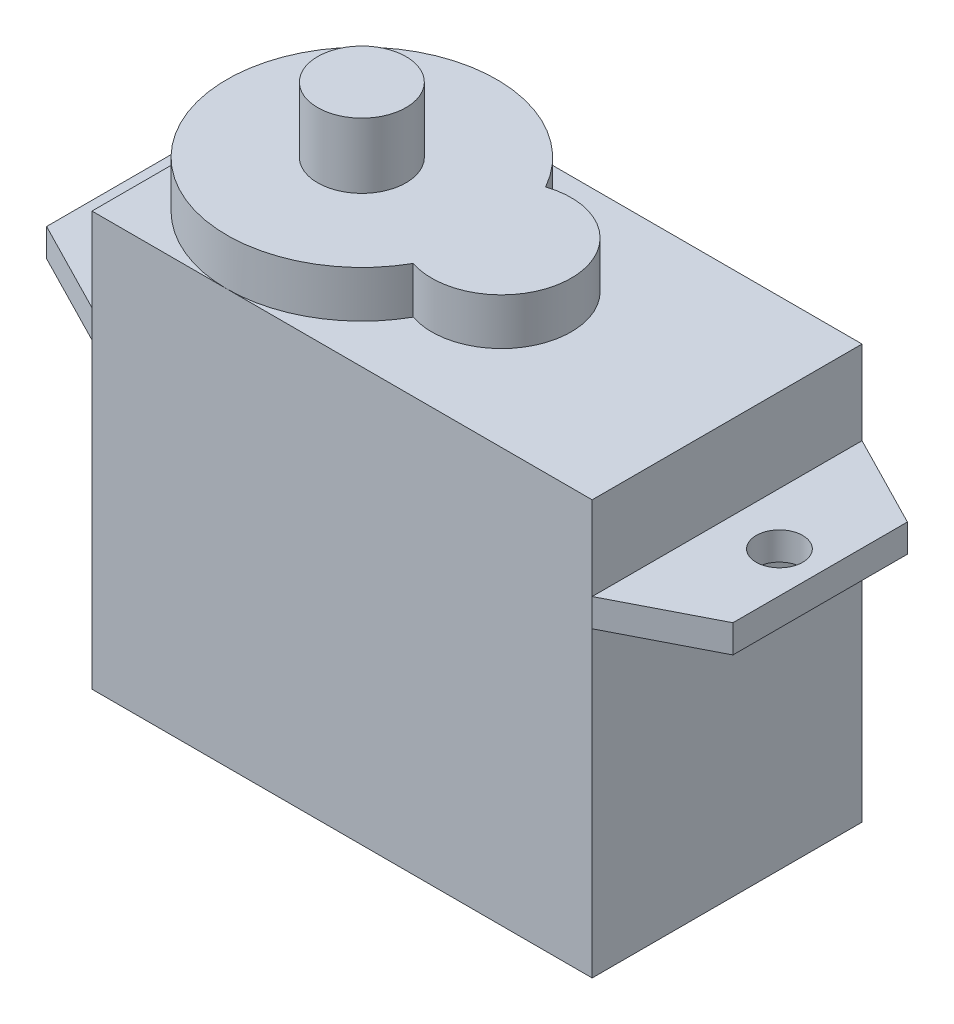
ISO-10303-21;
HEADER;
FILE_DESCRIPTION(('STEP AP214'),'2;1');
FILE_NAME('part.step','',(''),(''),'','','');
FILE_SCHEMA(('AUTOMOTIVE_DESIGN { 1 0 10303 214 1 1 1 1 }'));
ENDSEC;
DATA;
#1=APPLICATION_CONTEXT('core data for automotive mechanical design processes');
#2=APPLICATION_PROTOCOL_DEFINITION('international standard','automotive_design',2000,#1);
#3=PRODUCT_CONTEXT('',#1,'mechanical');
#4=PRODUCT('Part','Part','',(#3));
#5=PRODUCT_RELATED_PRODUCT_CATEGORY('part','',(#4));
#6=PRODUCT_DEFINITION_FORMATION('','',#4);
#7=PRODUCT_DEFINITION_CONTEXT('part definition',#1,'design');
#8=PRODUCT_DEFINITION('design','',#6,#7);
#9=PRODUCT_DEFINITION_SHAPE('','',#8);
#10=(LENGTH_UNIT() NAMED_UNIT(*) SI_UNIT(.MILLI.,.METRE.));
#11=(NAMED_UNIT(*) PLANE_ANGLE_UNIT() SI_UNIT($,.RADIAN.));
#12=(NAMED_UNIT(*) SI_UNIT($,.STERADIAN.) SOLID_ANGLE_UNIT());
#13=UNCERTAINTY_MEASURE_WITH_UNIT(LENGTH_MEASURE(1.E-05),#10,'distance_accuracy_value','');
#14=(GEOMETRIC_REPRESENTATION_CONTEXT(3) GLOBAL_UNCERTAINTY_ASSIGNED_CONTEXT((#13)) GLOBAL_UNIT_ASSIGNED_CONTEXT((#10,
#11,#12)) REPRESENTATION_CONTEXT('',''));
#15=CARTESIAN_POINT('',(0.,0.,0.));
#16=DIRECTION('',(0.,0.,1.));
#17=DIRECTION('',(1.,0.,0.));
#18=AXIS2_PLACEMENT_3D('',#15,#16,#17);
#19=CARTESIAN_POINT('',(0.,17.8,0.));
#20=DIRECTION('',(0.,1.,0.));
#21=DIRECTION('',(0.,0.,1.));
#22=AXIS2_PLACEMENT_3D('',#19,#20,#21);
#23=PLANE('',#22);
#24=CARTESIAN_POINT('',(1.05,17.8,0.));
#25=DIRECTION('',(0.,1.,0.));
#26=DIRECTION('',(0.,0.,1.));
#27=AXIS2_PLACEMENT_3D('',#24,#25,#26);
#28=CIRCLE('',#27,3.);
#29=CARTESIAN_POINT('',(0.103333333333326,17.8,2.84672131095094));
#30=VERTEX_POINT('',#29);
#31=CARTESIAN_POINT('',(0.103333333333326,17.8,-2.84672131095094));
#32=VERTEX_POINT('',#31);
#33=EDGE_CURVE('E161',#30,#32,#28,.T.);
#34=ORIENTED_EDGE('',*,*,#33,.F.);
#35=CARTESIAN_POINT('',(-4.95,17.8,0.));
#36=DIRECTION('',(0.,1.,0.));
#37=DIRECTION('',(0.,0.,1.));
#38=AXIS2_PLACEMENT_3D('',#35,#36,#37);
#39=CIRCLE('',#38,5.8);
#40=CARTESIAN_POINT('',(-4.95,17.8,5.8));
#41=VERTEX_POINT('',#40);
#42=EDGE_CURVE('E286',#41,#30,#39,.T.);
#43=ORIENTED_EDGE('',*,*,#42,.F.);
#44=DIRECTION('',(1.,0.,0.));
#45=VECTOR('',#44,1.);
#46=CARTESIAN_POINT('',(-10.75,17.8,5.8));
#47=LINE('',#46,#45);
#48=CARTESIAN_POINT('',(10.75,17.8,5.8));
#49=VERTEX_POINT('',#48);
#50=EDGE_CURVE('E171',#41,#49,#47,.T.);
#51=ORIENTED_EDGE('',*,*,#50,.T.);
#52=DIRECTION('',(0.,0.,-1.));
#53=VECTOR('',#52,1.);
#54=CARTESIAN_POINT('',(10.75,17.8,-5.8));
#55=LINE('',#54,#53);
#56=CARTESIAN_POINT('',(10.75,17.8,-5.8));
#57=VERTEX_POINT('',#56);
#58=EDGE_CURVE('E176',#49,#57,#55,.T.);
#59=ORIENTED_EDGE('',*,*,#58,.T.);
#60=DIRECTION('',(-1.,0.,0.));
#61=VECTOR('',#60,1.);
#62=CARTESIAN_POINT('',(-10.75,17.8,-5.8));
#63=LINE('',#62,#61);
#64=CARTESIAN_POINT('',(-4.95,17.8,-5.8));
#65=VERTEX_POINT('',#64);
#66=EDGE_CURVE('E179',#57,#65,#63,.T.);
#67=ORIENTED_EDGE('',*,*,#66,.T.);
#68=EDGE_CURVE('E44',#32,#65,#39,.T.);
#69=ORIENTED_EDGE('',*,*,#68,.F.);
#70=EDGE_LOOP('',(#34,#43,#51,#59,#67,#69));
#71=FACE_BOUND('',#70,.T.);
#72=ADVANCED_FACE('F33',(#71),#23,.T.);
#73=CARTESIAN_POINT('',(-10.75,17.8,0.));
#74=VERTEX_POINT('',#73);
#75=EDGE_CURVE('E11',#65,#74,#39,.T.);
#76=ORIENTED_EDGE('',*,*,#75,.F.);
#77=CARTESIAN_POINT('',(-10.75,17.8,-5.8));
#78=VERTEX_POINT('',#77);
#79=EDGE_CURVE('E178',#65,#78,#63,.T.);
#80=ORIENTED_EDGE('',*,*,#79,.T.);
#81=DIRECTION('',(0.,0.,1.));
#82=VECTOR('',#81,1.);
#83=CARTESIAN_POINT('',(-10.75,17.8,-5.8));
#84=LINE('',#83,#82);
#85=EDGE_CURVE('E169',#78,#74,#84,.T.);
#86=ORIENTED_EDGE('',*,*,#85,.T.);
#87=EDGE_LOOP('',(#76,#80,#86));
#88=FACE_BOUND('',#87,.T.);
#89=ADVANCED_FACE('F311',(#88),#23,.T.);
#90=CARTESIAN_POINT('',(0.,14.2,0.));
#91=DIRECTION('',(0.,1.,0.));
#92=DIRECTION('',(0.,0.,1.));
#93=AXIS2_PLACEMENT_3D('',#90,#91,#92);
#94=PLANE('',#93);
#95=DIRECTION('',(0.,0.,1.));
#96=VECTOR('',#95,1.);
#97=CARTESIAN_POINT('',(-10.75,14.2,-5.8));
#98=LINE('',#97,#96);
#99=CARTESIAN_POINT('',(-10.75,14.2,-5.8));
#100=VERTEX_POINT('',#99);
#101=CARTESIAN_POINT('',(-10.75,14.2,5.8));
#102=VERTEX_POINT('',#101);
#103=EDGE_CURVE('E162',#100,#102,#98,.T.);
#104=ORIENTED_EDGE('',*,*,#103,.F.);
#105=DIRECTION('',(-0.889933250556876,0.,0.456090790910399));
#106=VECTOR('',#105,1.);
#107=CARTESIAN_POINT('',(-10.75,14.2,-5.8));
#108=LINE('',#107,#106);
#109=CARTESIAN_POINT('',(-14.75,14.2,-3.75));
#110=VERTEX_POINT('',#109);
#111=EDGE_CURVE('E217',#100,#110,#108,.T.);
#112=ORIENTED_EDGE('',*,*,#111,.T.);
#113=DIRECTION('',(0.,0.,1.));
#114=VECTOR('',#113,1.);
#115=CARTESIAN_POINT('',(-14.75,14.2,-3.75));
#116=LINE('',#115,#114);
#117=CARTESIAN_POINT('',(-14.75,14.2,3.75));
#118=VERTEX_POINT('',#117);
#119=EDGE_CURVE('E219',#110,#118,#116,.T.);
#120=ORIENTED_EDGE('',*,*,#119,.T.);
#121=DIRECTION('',(0.889933250556876,0.,0.456090790910399));
#122=VECTOR('',#121,1.);
#123=CARTESIAN_POINT('',(-14.75,14.2,3.75));
#124=LINE('',#123,#122);
#125=EDGE_CURVE('E221',#118,#102,#124,.T.);
#126=ORIENTED_EDGE('',*,*,#125,.T.);
#127=EDGE_LOOP('',(#104,#112,#120,#126));
#128=FACE_BOUND('',#127,.T.);
#129=CARTESIAN_POINT('',(-13.,14.2,0.));
#130=DIRECTION('',(0.,1.,0.));
#131=DIRECTION('',(0.,0.,1.));
#132=AXIS2_PLACEMENT_3D('',#129,#130,#131);
#133=CIRCLE('',#132,1.);
#134=CARTESIAN_POINT('',(-13.,14.2,1.));
#135=VERTEX_POINT('',#134);
#136=EDGE_CURVE('E202',#135,#135,#133,.T.);
#137=ORIENTED_EDGE('',*,*,#136,.F.);
#138=EDGE_LOOP('',(#137));
#139=FACE_BOUND('',#138,.T.);
#140=ADVANCED_FACE('F317',(#128,#139),#94,.T.);
#141=CARTESIAN_POINT('',(10.75,13.,-5.8));
#142=DIRECTION('',(-1.,0.,0.));
#143=DIRECTION('',(0.,0.,1.));
#144=AXIS2_PLACEMENT_3D('',#141,#142,#143);
#145=PLANE('',#144);
#146=DIRECTION('',(0.,0.,-1.));
#147=VECTOR('',#146,1.);
#148=CARTESIAN_POINT('',(10.75,0.,-5.8));
#149=LINE('',#148,#147);
#150=CARTESIAN_POINT('',(10.75,0.,5.8));
#151=VERTEX_POINT('',#150);
#152=CARTESIAN_POINT('',(10.75,0.,-5.8));
#153=VERTEX_POINT('',#152);
#154=EDGE_CURVE('E260',#151,#153,#149,.T.);
#155=ORIENTED_EDGE('',*,*,#154,.T.);
#156=DIRECTION('',(0.,-1.,0.));
#157=VECTOR('',#156,1.);
#158=CARTESIAN_POINT('',(10.75,13.,-5.8));
#159=LINE('',#158,#157);
#160=CARTESIAN_POINT('',(10.75,13.,-5.8));
#161=VERTEX_POINT('',#160);
#162=EDGE_CURVE('E37',#161,#153,#159,.T.);
#163=ORIENTED_EDGE('',*,*,#162,.F.);
#164=DIRECTION('',(0.,0.,-1.));
#165=VECTOR('',#164,1.);
#166=CARTESIAN_POINT('',(10.75,13.,-5.8));
#167=LINE('',#166,#165);
#168=CARTESIAN_POINT('',(10.75,13.,5.8));
#169=VERTEX_POINT('',#168);
#170=EDGE_CURVE('E261',#169,#161,#167,.T.);
#171=ORIENTED_EDGE('',*,*,#170,.F.);
#172=DIRECTION('',(0.,-1.,0.));
#173=VECTOR('',#172,1.);
#174=CARTESIAN_POINT('',(10.75,13.,5.8));
#175=LINE('',#174,#173);
#176=EDGE_CURVE('E268',#169,#151,#175,.T.);
#177=ORIENTED_EDGE('',*,*,#176,.T.);
#178=EDGE_LOOP('',(#155,#163,#171,#177));
#179=FACE_BOUND('',#178,.T.);
#180=ADVANCED_FACE('F35',(#179),#145,.F.);
#181=CARTESIAN_POINT('',(-10.75,13.,-5.8));
#182=DIRECTION('',(0.,0.,1.));
#183=DIRECTION('',(1.,0.,0.));
#184=AXIS2_PLACEMENT_3D('',#181,#182,#183);
#185=PLANE('',#184);
#186=DIRECTION('',(-1.,0.,0.));
#187=VECTOR('',#186,1.);
#188=CARTESIAN_POINT('',(-10.75,0.,-5.8));
#189=LINE('',#188,#187);
#190=CARTESIAN_POINT('',(-10.75,0.,-5.8));
#191=VERTEX_POINT('',#190);
#192=EDGE_CURVE('E271',#153,#191,#189,.T.);
#193=ORIENTED_EDGE('',*,*,#192,.T.);
#194=DIRECTION('',(0.,-1.,0.));
#195=VECTOR('',#194,1.);
#196=CARTESIAN_POINT('',(-10.75,13.,-5.8));
#197=LINE('',#196,#195);
#198=CARTESIAN_POINT('',(-10.75,13.,-5.8));
#199=VERTEX_POINT('',#198);
#200=EDGE_CURVE('E280',#199,#191,#197,.T.);
#201=ORIENTED_EDGE('',*,*,#200,.F.);
#202=DIRECTION('',(0.,-1.,0.));
#203=VECTOR('',#202,1.);
#204=CARTESIAN_POINT('',(-10.75,14.2,-5.8));
#205=LINE('',#204,#203);
#206=EDGE_CURVE('E248',#100,#199,#205,.T.);
#207=ORIENTED_EDGE('',*,*,#206,.F.);
#208=DIRECTION('',(0.,-1.,0.));
#209=VECTOR('',#208,1.);
#210=CARTESIAN_POINT('',(-10.75,17.8,-5.8));
#211=LINE('',#210,#209);
#212=EDGE_CURVE('E180',#78,#100,#211,.T.);
#213=ORIENTED_EDGE('',*,*,#212,.F.);
#214=ORIENTED_EDGE('',*,*,#79,.F.);
#215=ORIENTED_EDGE('',*,*,#66,.F.);
#216=DIRECTION('',(0.,-1.,0.));
#217=VECTOR('',#216,1.);
#218=CARTESIAN_POINT('',(10.75,17.8,-5.8));
#219=LINE('',#218,#217);
#220=CARTESIAN_POINT('',(10.75,14.2,-5.8));
#221=VERTEX_POINT('',#220);
#222=EDGE_CURVE('E186',#57,#221,#219,.T.);
#223=ORIENTED_EDGE('',*,*,#222,.T.);
#224=DIRECTION('',(0.,-1.,0.));
#225=VECTOR('',#224,1.);
#226=CARTESIAN_POINT('',(10.75,14.2,-5.8));
#227=LINE('',#226,#225);
#228=EDGE_CURVE('E251',#221,#161,#227,.T.);
#229=ORIENTED_EDGE('',*,*,#228,.T.);
#230=ORIENTED_EDGE('',*,*,#162,.T.);
#231=EDGE_LOOP('',(#193,#201,#207,#213,#214,#215,#223,#229,#230));
#232=FACE_BOUND('',#231,.T.);
#233=ADVANCED_FACE('F337',(#232),#185,.F.);
#234=CARTESIAN_POINT('',(-10.75,13.,-5.8));
#235=DIRECTION('',(1.,0.,0.));
#236=DIRECTION('',(0.,0.,-1.));
#237=AXIS2_PLACEMENT_3D('',#234,#235,#236);
#238=PLANE('',#237);
#239=DIRECTION('',(0.,0.,1.));
#240=VECTOR('',#239,1.);
#241=CARTESIAN_POINT('',(-10.75,0.,-5.8));
#242=LINE('',#241,#240);
#243=CARTESIAN_POINT('',(-10.75,0.,5.8));
#244=VERTEX_POINT('',#243);
#245=EDGE_CURVE('E273',#191,#244,#242,.T.);
#246=ORIENTED_EDGE('',*,*,#245,.T.);
#247=DIRECTION('',(0.,-1.,0.));
#248=VECTOR('',#247,1.);
#249=CARTESIAN_POINT('',(-10.75,13.,5.8));
#250=LINE('',#249,#248);
#251=CARTESIAN_POINT('',(-10.75,13.,5.8));
#252=VERTEX_POINT('',#251);
#253=EDGE_CURVE('E278',#252,#244,#250,.T.);
#254=ORIENTED_EDGE('',*,*,#253,.F.);
#255=DIRECTION('',(0.,0.,1.));
#256=VECTOR('',#255,1.);
#257=CARTESIAN_POINT('',(-10.75,13.,-5.8));
#258=LINE('',#257,#256);
#259=EDGE_CURVE('E264',#199,#252,#258,.T.);
#260=ORIENTED_EDGE('',*,*,#259,.F.);
#261=ORIENTED_EDGE('',*,*,#200,.T.);
#262=EDGE_LOOP('',(#246,#254,#260,#261));
#263=FACE_BOUND('',#262,.T.);
#264=ADVANCED_FACE('F379',(#263),#238,.F.);
#265=CARTESIAN_POINT('',(-10.75,13.,5.8));
#266=DIRECTION('',(0.,0.,-1.));
#267=DIRECTION('',(-1.,0.,0.));
#268=AXIS2_PLACEMENT_3D('',#265,#266,#267);
#269=PLANE('',#268);
#270=DIRECTION('',(1.,0.,0.));
#271=VECTOR('',#270,1.);
#272=CARTESIAN_POINT('',(-10.75,0.,5.8));
#273=LINE('',#272,#271);
#274=EDGE_CURVE('E265',#244,#151,#273,.T.);
#275=ORIENTED_EDGE('',*,*,#274,.T.);
#276=ORIENTED_EDGE('',*,*,#176,.F.);
#277=DIRECTION('',(0.,-1.,0.));
#278=VECTOR('',#277,1.);
#279=CARTESIAN_POINT('',(10.75,14.2,5.8));
#280=LINE('',#279,#278);
#281=CARTESIAN_POINT('',(10.75,14.2,5.8));
#282=VERTEX_POINT('',#281);
#283=EDGE_CURVE('E223',#282,#169,#280,.T.);
#284=ORIENTED_EDGE('',*,*,#283,.F.);
#285=DIRECTION('',(0.,-1.,0.));
#286=VECTOR('',#285,1.);
#287=CARTESIAN_POINT('',(10.75,17.8,5.8));
#288=LINE('',#287,#286);
#289=EDGE_CURVE('E189',#49,#282,#288,.T.);
#290=ORIENTED_EDGE('',*,*,#289,.F.);
#291=ORIENTED_EDGE('',*,*,#50,.F.);
#292=CARTESIAN_POINT('',(-10.75,17.8,5.8));
#293=VERTEX_POINT('',#292);
#294=EDGE_CURVE('E173',#293,#41,#47,.T.);
#295=ORIENTED_EDGE('',*,*,#294,.F.);
#296=DIRECTION('',(0.,-1.,0.));
#297=VECTOR('',#296,1.);
#298=CARTESIAN_POINT('',(-10.75,17.8,5.8));
#299=LINE('',#298,#297);
#300=EDGE_CURVE('E192',#293,#102,#299,.T.);
#301=ORIENTED_EDGE('',*,*,#300,.T.);
#302=DIRECTION('',(0.,-1.,0.));
#303=VECTOR('',#302,1.);
#304=CARTESIAN_POINT('',(-10.75,14.2,5.8));
#305=LINE('',#304,#303);
#306=EDGE_CURVE('E239',#102,#252,#305,.T.);
#307=ORIENTED_EDGE('',*,*,#306,.T.);
#308=ORIENTED_EDGE('',*,*,#253,.T.);
#309=EDGE_LOOP('',(#275,#276,#284,#290,#291,#295,#301,#307,#308));
#310=FACE_BOUND('',#309,.T.);
#311=ADVANCED_FACE('F350',(#310),#269,.F.);
#312=CARTESIAN_POINT('',(0.,0.,0.));
#313=DIRECTION('',(0.,1.,0.));
#314=DIRECTION('',(0.,0.,1.));
#315=AXIS2_PLACEMENT_3D('',#312,#313,#314);
#316=PLANE('',#315);
#317=ORIENTED_EDGE('',*,*,#154,.F.);
#318=ORIENTED_EDGE('',*,*,#274,.F.);
#319=ORIENTED_EDGE('',*,*,#245,.F.);
#320=ORIENTED_EDGE('',*,*,#192,.F.);
#321=EDGE_LOOP('',(#317,#318,#319,#320));
#322=FACE_BOUND('',#321,.T.);
#323=ADVANCED_FACE('F378',(#322),#316,.F.);
#324=CARTESIAN_POINT('',(0.,13.,0.));
#325=DIRECTION('',(0.,1.,0.));
#326=DIRECTION('',(0.,0.,1.));
#327=AXIS2_PLACEMENT_3D('',#324,#325,#326);
#328=PLANE('',#327);
#329=CARTESIAN_POINT('',(13.,13.,0.));
#330=DIRECTION('',(0.,1.,0.));
#331=DIRECTION('',(0.,0.,-1.));
#332=AXIS2_PLACEMENT_3D('',#329,#330,#331);
#333=CIRCLE('',#332,1.);
#334=CARTESIAN_POINT('',(13.,13.,-1.));
#335=VERTEX_POINT('',#334);
#336=EDGE_CURVE('E195',#335,#335,#333,.T.);
#337=ORIENTED_EDGE('',*,*,#336,.T.);
#338=EDGE_LOOP('',(#337));
#339=FACE_BOUND('',#338,.T.);
#340=DIRECTION('',(0.889933250556876,0.,-0.456090790910399));
#341=VECTOR('',#340,1.);
#342=CARTESIAN_POINT('',(14.75,13.,3.75));
#343=LINE('',#342,#341);
#344=CARTESIAN_POINT('',(14.75,13.,3.75));
#345=VERTEX_POINT('',#344);
#346=EDGE_CURVE('E205',#169,#345,#343,.T.);
#347=ORIENTED_EDGE('',*,*,#346,.F.);
#348=ORIENTED_EDGE('',*,*,#170,.T.);
#349=DIRECTION('',(-0.889933250556876,0.,-0.456090790910399));
#350=VECTOR('',#349,1.);
#351=CARTESIAN_POINT('',(10.75,13.,-5.8));
#352=LINE('',#351,#350);
#353=CARTESIAN_POINT('',(14.75,13.,-3.75));
#354=VERTEX_POINT('',#353);
#355=EDGE_CURVE('E228',#354,#161,#352,.T.);
#356=ORIENTED_EDGE('',*,*,#355,.F.);
#357=DIRECTION('',(0.,0.,-1.));
#358=VECTOR('',#357,1.);
#359=CARTESIAN_POINT('',(14.75,13.,-3.75));
#360=LINE('',#359,#358);
#361=EDGE_CURVE('E226',#345,#354,#360,.T.);
#362=ORIENTED_EDGE('',*,*,#361,.F.);
#363=EDGE_LOOP('',(#347,#348,#356,#362));
#364=FACE_BOUND('',#363,.T.);
#365=ADVANCED_FACE('F370',(#339,#364),#328,.F.);
#366=CARTESIAN_POINT('',(-13.,13.,0.));
#367=DIRECTION('',(0.,1.,0.));
#368=DIRECTION('',(0.,0.,1.));
#369=AXIS2_PLACEMENT_3D('',#366,#367,#368);
#370=CIRCLE('',#369,1.);
#371=CARTESIAN_POINT('',(-13.,13.,1.));
#372=VERTEX_POINT('',#371);
#373=EDGE_CURVE('E199',#372,#372,#370,.T.);
#374=ORIENTED_EDGE('',*,*,#373,.T.);
#375=EDGE_LOOP('',(#374));
#376=FACE_BOUND('',#375,.T.);
#377=DIRECTION('',(-0.889933250556876,0.,0.456090790910399));
#378=VECTOR('',#377,1.);
#379=CARTESIAN_POINT('',(-10.75,13.,-5.8));
#380=LINE('',#379,#378);
#381=CARTESIAN_POINT('',(-14.75,13.,-3.75));
#382=VERTEX_POINT('',#381);
#383=EDGE_CURVE('E231',#199,#382,#380,.T.);
#384=ORIENTED_EDGE('',*,*,#383,.F.);
#385=ORIENTED_EDGE('',*,*,#259,.T.);
#386=DIRECTION('',(0.889933250556876,0.,0.456090790910399));
#387=VECTOR('',#386,1.);
#388=CARTESIAN_POINT('',(-14.75,13.,3.75));
#389=LINE('',#388,#387);
#390=CARTESIAN_POINT('',(-14.75,13.,3.75));
#391=VERTEX_POINT('',#390);
#392=EDGE_CURVE('E212',#391,#252,#389,.T.);
#393=ORIENTED_EDGE('',*,*,#392,.F.);
#394=DIRECTION('',(0.,0.,1.));
#395=VECTOR('',#394,1.);
#396=CARTESIAN_POINT('',(-14.75,13.,-3.75));
#397=LINE('',#396,#395);
#398=EDGE_CURVE('E233',#382,#391,#397,.T.);
#399=ORIENTED_EDGE('',*,*,#398,.F.);
#400=EDGE_LOOP('',(#384,#385,#393,#399));
#401=FACE_BOUND('',#400,.T.);
#402=ADVANCED_FACE('F385',(#376,#401),#328,.F.);
#403=DIRECTION('',(0.,0.,-1.));
#404=VECTOR('',#403,1.);
#405=CARTESIAN_POINT('',(10.75,14.2,-5.8));
#406=LINE('',#405,#404);
#407=EDGE_CURVE('E165',#282,#221,#406,.T.);
#408=ORIENTED_EDGE('',*,*,#407,.F.);
#409=DIRECTION('',(0.889933250556876,0.,-0.456090790910399));
#410=VECTOR('',#409,1.);
#411=CARTESIAN_POINT('',(14.75,14.2,3.75));
#412=LINE('',#411,#410);
#413=CARTESIAN_POINT('',(14.75,14.2,3.75));
#414=VERTEX_POINT('',#413);
#415=EDGE_CURVE('E208',#282,#414,#412,.T.);
#416=ORIENTED_EDGE('',*,*,#415,.T.);
#417=DIRECTION('',(0.,0.,-1.));
#418=VECTOR('',#417,1.);
#419=CARTESIAN_POINT('',(14.75,14.2,-3.75));
#420=LINE('',#419,#418);
#421=CARTESIAN_POINT('',(14.75,14.2,-3.75));
#422=VERTEX_POINT('',#421);
#423=EDGE_CURVE('E211',#414,#422,#420,.T.);
#424=ORIENTED_EDGE('',*,*,#423,.T.);
#425=DIRECTION('',(-0.889933250556876,0.,-0.456090790910399));
#426=VECTOR('',#425,1.);
#427=CARTESIAN_POINT('',(10.75,14.2,-5.8));
#428=LINE('',#427,#426);
#429=EDGE_CURVE('E214',#422,#221,#428,.T.);
#430=ORIENTED_EDGE('',*,*,#429,.T.);
#431=EDGE_LOOP('',(#408,#416,#424,#430));
#432=FACE_BOUND('',#431,.T.);
#433=CARTESIAN_POINT('',(13.,14.2,0.));
#434=DIRECTION('',(0.,1.,0.));
#435=DIRECTION('',(0.,0.,-1.));
#436=AXIS2_PLACEMENT_3D('',#433,#434,#435);
#437=CIRCLE('',#436,1.);
#438=CARTESIAN_POINT('',(13.,14.2,-1.));
#439=VERTEX_POINT('',#438);
#440=EDGE_CURVE('E196',#439,#439,#437,.T.);
#441=ORIENTED_EDGE('',*,*,#440,.F.);
#442=EDGE_LOOP('',(#441));
#443=FACE_BOUND('',#442,.T.);
#444=ADVANCED_FACE('F361',(#432,#443),#94,.T.);
#445=CARTESIAN_POINT('',(14.75,14.2,3.75));
#446=DIRECTION('',(-0.456090790910399,0.,-0.889933250556876));
#447=DIRECTION('',(-0.889933250556876,0.,0.456090790910399));
#448=AXIS2_PLACEMENT_3D('',#445,#446,#447);
#449=PLANE('',#448);
#450=ORIENTED_EDGE('',*,*,#346,.T.);
#451=DIRECTION('',(0.,-1.,0.));
#452=VECTOR('',#451,1.);
#453=CARTESIAN_POINT('',(14.75,14.2,3.75));
#454=LINE('',#453,#452);
#455=EDGE_CURVE('E257',#414,#345,#454,.T.);
#456=ORIENTED_EDGE('',*,*,#455,.F.);
#457=ORIENTED_EDGE('',*,*,#415,.F.);
#458=ORIENTED_EDGE('',*,*,#283,.T.);
#459=EDGE_LOOP('',(#450,#456,#457,#458));
#460=FACE_BOUND('',#459,.T.);
#461=ADVANCED_FACE('F375',(#460),#449,.F.);
#462=CARTESIAN_POINT('',(14.75,14.2,-3.75));
#463=DIRECTION('',(-1.,0.,0.));
#464=DIRECTION('',(0.,0.,1.));
#465=AXIS2_PLACEMENT_3D('',#462,#463,#464);
#466=PLANE('',#465);
#467=ORIENTED_EDGE('',*,*,#361,.T.);
#468=DIRECTION('',(0.,-1.,0.));
#469=VECTOR('',#468,1.);
#470=CARTESIAN_POINT('',(14.75,14.2,-3.75));
#471=LINE('',#470,#469);
#472=EDGE_CURVE('E254',#422,#354,#471,.T.);
#473=ORIENTED_EDGE('',*,*,#472,.F.);
#474=ORIENTED_EDGE('',*,*,#423,.F.);
#475=ORIENTED_EDGE('',*,*,#455,.T.);
#476=EDGE_LOOP('',(#467,#473,#474,#475));
#477=FACE_BOUND('',#476,.T.);
#478=ADVANCED_FACE('F367',(#477),#466,.F.);
#479=CARTESIAN_POINT('',(10.75,14.2,-5.8));
#480=DIRECTION('',(-0.456090790910399,0.,0.889933250556876));
#481=DIRECTION('',(0.889933250556876,0.,0.456090790910399));
#482=AXIS2_PLACEMENT_3D('',#479,#480,#481);
#483=PLANE('',#482);
#484=ORIENTED_EDGE('',*,*,#355,.T.);
#485=ORIENTED_EDGE('',*,*,#228,.F.);
#486=ORIENTED_EDGE('',*,*,#429,.F.);
#487=ORIENTED_EDGE('',*,*,#472,.T.);
#488=EDGE_LOOP('',(#484,#485,#486,#487));
#489=FACE_BOUND('',#488,.T.);
#490=ADVANCED_FACE('F358',(#489),#483,.F.);
#491=CARTESIAN_POINT('',(-10.75,14.2,-5.8));
#492=DIRECTION('',(0.456090790910399,0.,0.889933250556876));
#493=DIRECTION('',(0.889933250556876,0.,-0.456090790910399));
#494=AXIS2_PLACEMENT_3D('',#491,#492,#493);
#495=PLANE('',#494);
#496=ORIENTED_EDGE('',*,*,#383,.T.);
#497=DIRECTION('',(0.,-1.,0.));
#498=VECTOR('',#497,1.);
#499=CARTESIAN_POINT('',(-14.75,14.2,-3.75));
#500=LINE('',#499,#498);
#501=EDGE_CURVE('E245',#110,#382,#500,.T.);
#502=ORIENTED_EDGE('',*,*,#501,.F.);
#503=ORIENTED_EDGE('',*,*,#111,.F.);
#504=ORIENTED_EDGE('',*,*,#206,.T.);
#505=EDGE_LOOP('',(#496,#502,#503,#504));
#506=FACE_BOUND('',#505,.T.);
#507=ADVANCED_FACE('F383',(#506),#495,.F.);
#508=CARTESIAN_POINT('',(-14.75,14.2,-3.75));
#509=DIRECTION('',(1.,0.,0.));
#510=DIRECTION('',(0.,0.,-1.));
#511=AXIS2_PLACEMENT_3D('',#508,#509,#510);
#512=PLANE('',#511);
#513=ORIENTED_EDGE('',*,*,#398,.T.);
#514=DIRECTION('',(0.,-1.,0.));
#515=VECTOR('',#514,1.);
#516=CARTESIAN_POINT('',(-14.75,14.2,3.75));
#517=LINE('',#516,#515);
#518=EDGE_CURVE('E242',#118,#391,#517,.T.);
#519=ORIENTED_EDGE('',*,*,#518,.F.);
#520=ORIENTED_EDGE('',*,*,#119,.F.);
#521=ORIENTED_EDGE('',*,*,#501,.T.);
#522=EDGE_LOOP('',(#513,#519,#520,#521));
#523=FACE_BOUND('',#522,.T.);
#524=ADVANCED_FACE('F387',(#523),#512,.F.);
#525=CARTESIAN_POINT('',(-14.75,14.2,3.75));
#526=DIRECTION('',(0.456090790910399,0.,-0.889933250556876));
#527=DIRECTION('',(-0.889933250556876,0.,-0.456090790910399));
#528=AXIS2_PLACEMENT_3D('',#525,#526,#527);
#529=PLANE('',#528);
#530=ORIENTED_EDGE('',*,*,#392,.T.);
#531=ORIENTED_EDGE('',*,*,#306,.F.);
#532=ORIENTED_EDGE('',*,*,#125,.F.);
#533=ORIENTED_EDGE('',*,*,#518,.T.);
#534=EDGE_LOOP('',(#530,#531,#532,#533));
#535=FACE_BOUND('',#534,.T.);
#536=ADVANCED_FACE('F347',(#535),#529,.F.);
#537=CARTESIAN_POINT('',(-13.,14.2,0.));
#538=DIRECTION('',(0.,-1.,0.));
#539=DIRECTION('',(0.,0.,-1.));
#540=AXIS2_PLACEMENT_3D('',#537,#538,#539);
#541=CYLINDRICAL_SURFACE('',#540,1.);
#542=ORIENTED_EDGE('',*,*,#136,.T.);
#543=EDGE_LOOP('',(#542));
#544=FACE_BOUND('',#543,.T.);
#545=ORIENTED_EDGE('',*,*,#373,.F.);
#546=EDGE_LOOP('',(#545));
#547=FACE_BOUND('',#546,.T.);
#548=ADVANCED_FACE('F394',(#544,#547),#541,.F.);
#549=CARTESIAN_POINT('',(13.,14.2,0.));
#550=DIRECTION('',(0.,-1.,0.));
#551=DIRECTION('',(0.,0.,-1.));
#552=AXIS2_PLACEMENT_3D('',#549,#550,#551);
#553=CYLINDRICAL_SURFACE('',#552,1.);
#554=ORIENTED_EDGE('',*,*,#440,.T.);
#555=EDGE_LOOP('',(#554));
#556=FACE_BOUND('',#555,.T.);
#557=ORIENTED_EDGE('',*,*,#336,.F.);
#558=EDGE_LOOP('',(#557));
#559=FACE_BOUND('',#558,.T.);
#560=ADVANCED_FACE('F433',(#556,#559),#553,.F.);
#561=CARTESIAN_POINT('',(-10.75,17.8,-5.8));
#562=DIRECTION('',(1.,0.,0.));
#563=DIRECTION('',(0.,0.,-1.));
#564=AXIS2_PLACEMENT_3D('',#561,#562,#563);
#565=PLANE('',#564);
#566=ORIENTED_EDGE('',*,*,#103,.T.);
#567=ORIENTED_EDGE('',*,*,#300,.F.);
#568=EDGE_CURVE('E172',#74,#293,#84,.T.);
#569=ORIENTED_EDGE('',*,*,#568,.F.);
#570=ORIENTED_EDGE('',*,*,#85,.F.);
#571=ORIENTED_EDGE('',*,*,#212,.T.);
#572=EDGE_LOOP('',(#566,#567,#569,#570,#571));
#573=FACE_BOUND('',#572,.T.);
#574=ADVANCED_FACE('F327',(#573),#565,.F.);
#575=CARTESIAN_POINT('',(10.75,17.8,-5.8));
#576=DIRECTION('',(-1.,0.,0.));
#577=DIRECTION('',(0.,0.,1.));
#578=AXIS2_PLACEMENT_3D('',#575,#576,#577);
#579=PLANE('',#578);
#580=ORIENTED_EDGE('',*,*,#407,.T.);
#581=ORIENTED_EDGE('',*,*,#222,.F.);
#582=ORIENTED_EDGE('',*,*,#58,.F.);
#583=ORIENTED_EDGE('',*,*,#289,.T.);
#584=EDGE_LOOP('',(#580,#581,#582,#583));
#585=FACE_BOUND('',#584,.T.);
#586=ADVANCED_FACE('F321',(#585),#579,.F.);
#587=EDGE_CURVE('E42',#74,#41,#39,.T.);
#588=ORIENTED_EDGE('',*,*,#587,.F.);
#589=ORIENTED_EDGE('',*,*,#568,.T.);
#590=ORIENTED_EDGE('',*,*,#294,.T.);
#591=EDGE_LOOP('',(#588,#589,#590));
#592=FACE_BOUND('',#591,.T.);
#593=ADVANCED_FACE('F313',(#592),#23,.T.);
#594=CARTESIAN_POINT('',(1.05,19.8,0.));
#595=DIRECTION('',(0.,-1.,0.));
#596=DIRECTION('',(0.,0.,-1.));
#597=AXIS2_PLACEMENT_3D('',#594,#595,#596);
#598=CYLINDRICAL_SURFACE('',#597,3.);
#599=ORIENTED_EDGE('',*,*,#33,.T.);
#600=DIRECTION('',(0.,-1.,0.));
#601=VECTOR('',#600,1.);
#602=CARTESIAN_POINT('',(0.103333333333326,19.8,-2.84672131095094));
#603=LINE('',#602,#601);
#604=CARTESIAN_POINT('',(0.103333333333326,19.8,-2.84672131095094));
#605=VERTEX_POINT('',#604);
#606=EDGE_CURVE('E148',#605,#32,#603,.T.);
#607=ORIENTED_EDGE('',*,*,#606,.F.);
#608=CARTESIAN_POINT('',(1.05,19.8,0.));
#609=DIRECTION('',(0.,1.,0.));
#610=DIRECTION('',(0.,0.,1.));
#611=AXIS2_PLACEMENT_3D('',#608,#609,#610);
#612=CIRCLE('',#611,3.);
#613=CARTESIAN_POINT('',(0.103333333333326,19.8,2.84672131095094));
#614=VERTEX_POINT('',#613);
#615=EDGE_CURVE('E155',#614,#605,#612,.T.);
#616=ORIENTED_EDGE('',*,*,#615,.F.);
#617=DIRECTION('',(0.,-1.,0.));
#618=VECTOR('',#617,1.);
#619=CARTESIAN_POINT('',(0.103333333333326,19.8,2.84672131095094));
#620=LINE('',#619,#618);
#621=EDGE_CURVE('E152',#614,#30,#620,.T.);
#622=ORIENTED_EDGE('',*,*,#621,.T.);
#623=EDGE_LOOP('',(#599,#607,#616,#622));
#624=FACE_BOUND('',#623,.T.);
#625=ADVANCED_FACE('F160',(#624),#598,.T.);
#626=CARTESIAN_POINT('',(-4.95,19.8,0.));
#627=DIRECTION('',(0.,-1.,0.));
#628=DIRECTION('',(0.,0.,-1.));
#629=AXIS2_PLACEMENT_3D('',#626,#627,#628);
#630=CYLINDRICAL_SURFACE('',#629,5.8);
#631=ORIENTED_EDGE('',*,*,#68,.T.);
#632=ORIENTED_EDGE('',*,*,#75,.T.);
#633=ORIENTED_EDGE('',*,*,#587,.T.);
#634=ORIENTED_EDGE('',*,*,#42,.T.);
#635=ORIENTED_EDGE('',*,*,#621,.F.);
#636=CARTESIAN_POINT('',(-4.95,19.8,0.));
#637=DIRECTION('',(0.,1.,0.));
#638=DIRECTION('',(0.,0.,1.));
#639=AXIS2_PLACEMENT_3D('',#636,#637,#638);
#640=CIRCLE('',#639,5.8);
#641=EDGE_CURVE('E144',#605,#614,#640,.T.);
#642=ORIENTED_EDGE('',*,*,#641,.F.);
#643=ORIENTED_EDGE('',*,*,#606,.T.);
#644=EDGE_LOOP('',(#631,#632,#633,#634,#635,#642,#643));
#645=FACE_BOUND('',#644,.T.);
#646=ADVANCED_FACE('F146',(#645),#630,.T.);
#647=CARTESIAN_POINT('',(-1.95,19.8,0.));
#648=DIRECTION('',(0.,1.,0.));
#649=DIRECTION('',(0.,0.,1.));
#650=AXIS2_PLACEMENT_3D('',#647,#648,#649);
#651=PLANE('',#650);
#652=CARTESIAN_POINT('',(-4.95,19.8,0.));
#653=DIRECTION('',(0.,1.,0.));
#654=DIRECTION('',(0.,0.,1.));
#655=AXIS2_PLACEMENT_3D('',#652,#653,#654);
#656=CIRCLE('',#655,1.9);
#657=CARTESIAN_POINT('',(-4.95,19.8,1.9));
#658=VERTEX_POINT('',#657);
#659=EDGE_CURVE('E292',#658,#658,#656,.T.);
#660=ORIENTED_EDGE('',*,*,#659,.F.);
#661=EDGE_LOOP('',(#660));
#662=FACE_BOUND('',#661,.T.);
#663=ORIENTED_EDGE('',*,*,#615,.T.);
#664=ORIENTED_EDGE('',*,*,#641,.T.);
#665=EDGE_LOOP('',(#663,#664));
#666=FACE_BOUND('',#665,.T.);
#667=ADVANCED_FACE('F157',(#662,#666),#651,.T.);
#668=CARTESIAN_POINT('',(-4.95,22.6,0.));
#669=DIRECTION('',(0.,-1.,0.));
#670=DIRECTION('',(0.,0.,-1.));
#671=AXIS2_PLACEMENT_3D('',#668,#669,#670);
#672=CYLINDRICAL_SURFACE('',#671,1.9);
#673=CARTESIAN_POINT('',(-4.95,22.6,0.));
#674=DIRECTION('',(0.,1.,0.));
#675=DIRECTION('',(0.,0.,1.));
#676=AXIS2_PLACEMENT_3D('',#673,#674,#675);
#677=CIRCLE('',#676,1.9);
#678=CARTESIAN_POINT('',(-4.95,22.6,1.9));
#679=VERTEX_POINT('',#678);
#680=EDGE_CURVE('E290',#679,#679,#677,.T.);
#681=ORIENTED_EDGE('',*,*,#680,.F.);
#682=EDGE_LOOP('',(#681));
#683=FACE_BOUND('',#682,.T.);
#684=ORIENTED_EDGE('',*,*,#659,.T.);
#685=EDGE_LOOP('',(#684));
#686=FACE_BOUND('',#685,.T.);
#687=ADVANCED_FACE('F298',(#683,#686),#672,.T.);
#688=CARTESIAN_POINT('',(-4.95,22.6,0.));
#689=DIRECTION('',(0.,1.,0.));
#690=DIRECTION('',(0.,0.,1.));
#691=AXIS2_PLACEMENT_3D('',#688,#689,#690);
#692=PLANE('',#691);
#693=ORIENTED_EDGE('',*,*,#680,.T.);
#694=EDGE_LOOP('',(#693));
#695=FACE_BOUND('',#694,.T.);
#696=ADVANCED_FACE('F306',(#695),#692,.T.);
#697=CLOSED_SHELL('',(#72,#89,#140,#180,#233,#264,#311,#323,#365,#402,#444,#461,#478,#490,#507,
#524,#536,#548,#560,#574,#586,#593,#625,#646,#667,#687,#696));
#698=MANIFOLD_SOLID_BREP('B2',#697);
#699=ADVANCED_BREP_SHAPE_REPRESENTATION('',(#18,#698),#14);
#700=SHAPE_DEFINITION_REPRESENTATION(#9,#699);
ENDSEC;
END-ISO-10303-21;
